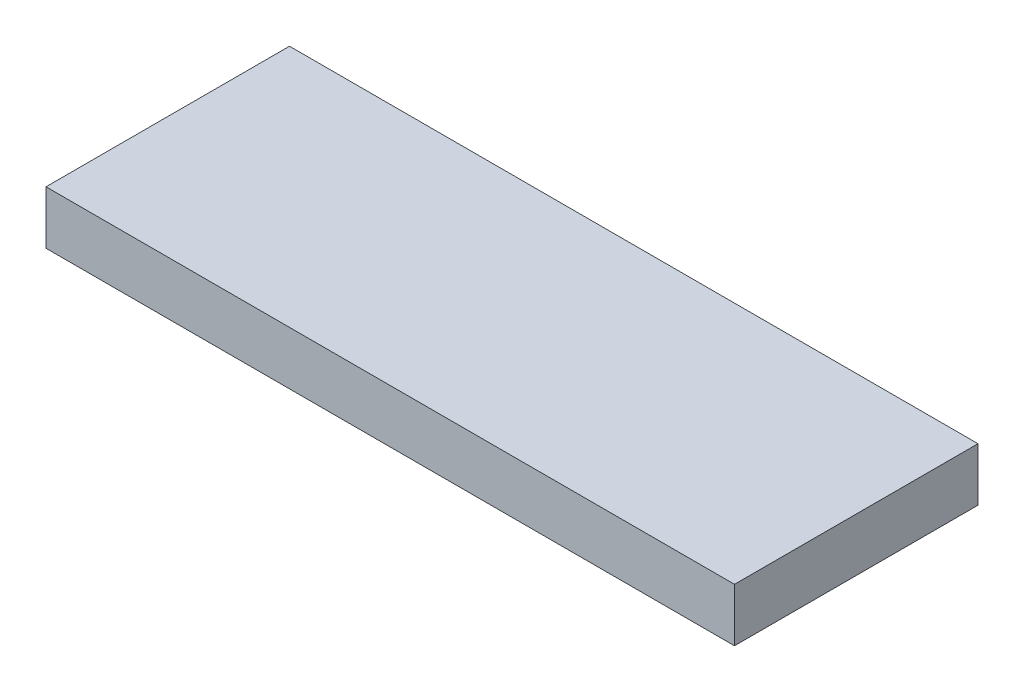
ISO-10303-21;
HEADER;
FILE_DESCRIPTION(('STEP AP214'),'2;1');
FILE_NAME('part.step','',(''),(''),'','','');
FILE_SCHEMA(('AUTOMOTIVE_DESIGN { 1 0 10303 214 1 1 1 1 }'));
ENDSEC;
DATA;
#1=APPLICATION_CONTEXT('core data for automotive mechanical design processes');
#2=APPLICATION_PROTOCOL_DEFINITION('international standard','automotive_design',2000,#1);
#3=PRODUCT_CONTEXT('',#1,'mechanical');
#4=PRODUCT('Part','Part','',(#3));
#5=PRODUCT_RELATED_PRODUCT_CATEGORY('part','',(#4));
#6=PRODUCT_DEFINITION_FORMATION('','',#4);
#7=PRODUCT_DEFINITION_CONTEXT('part definition',#1,'design');
#8=PRODUCT_DEFINITION('design','',#6,#7);
#9=PRODUCT_DEFINITION_SHAPE('','',#8);
#10=(LENGTH_UNIT() NAMED_UNIT(*) SI_UNIT(.MILLI.,.METRE.));
#11=(NAMED_UNIT(*) PLANE_ANGLE_UNIT() SI_UNIT($,.RADIAN.));
#12=(NAMED_UNIT(*) SI_UNIT($,.STERADIAN.) SOLID_ANGLE_UNIT());
#13=UNCERTAINTY_MEASURE_WITH_UNIT(LENGTH_MEASURE(1.E-05),#10,'distance_accuracy_value','');
#14=(GEOMETRIC_REPRESENTATION_CONTEXT(3) GLOBAL_UNCERTAINTY_ASSIGNED_CONTEXT((#13)) GLOBAL_UNIT_ASSIGNED_CONTEXT((#10,
#11,#12)) REPRESENTATION_CONTEXT('',''));
#15=CARTESIAN_POINT('',(0.,0.,0.));
#16=DIRECTION('',(0.,0.,1.));
#17=DIRECTION('',(1.,0.,0.));
#18=AXIS2_PLACEMENT_3D('',#15,#16,#17);
#19=CARTESIAN_POINT('',(0.,44.45,0.));
#20=DIRECTION('',(1.,0.,0.));
#21=DIRECTION('',(0.,0.,-1.));
#22=AXIS2_PLACEMENT_3D('',#19,#20,#21);
#23=PLANE('',#22);
#24=DIRECTION('',(0.,0.,1.));
#25=VECTOR('',#24,1.);
#26=CARTESIAN_POINT('',(0.,0.,0.));
#27=LINE('',#26,#25);
#28=CARTESIAN_POINT('',(0.,0.,-203.2));
#29=VERTEX_POINT('',#28);
#30=CARTESIAN_POINT('',(0.,0.,0.));
#31=VERTEX_POINT('',#30);
#32=EDGE_CURVE('E120',#29,#31,#27,.T.);
#33=ORIENTED_EDGE('',*,*,#32,.T.);
#34=DIRECTION('',(0.,-1.,0.));
#35=VECTOR('',#34,1.);
#36=CARTESIAN_POINT('',(0.,44.45,0.));
#37=LINE('',#36,#35);
#38=CARTESIAN_POINT('',(0.,44.45,0.));
#39=VERTEX_POINT('',#38);
#40=EDGE_CURVE('E11',#39,#31,#37,.T.);
#41=ORIENTED_EDGE('',*,*,#40,.F.);
#42=DIRECTION('',(0.,0.,1.));
#43=VECTOR('',#42,1.);
#44=CARTESIAN_POINT('',(0.,44.45,0.));
#45=LINE('',#44,#43);
#46=CARTESIAN_POINT('',(0.,44.45,-203.2));
#47=VERTEX_POINT('',#46);
#48=EDGE_CURVE('E101',#47,#39,#45,.T.);
#49=ORIENTED_EDGE('',*,*,#48,.F.);
#50=DIRECTION('',(0.,-1.,0.));
#51=VECTOR('',#50,1.);
#52=CARTESIAN_POINT('',(0.,44.45,-203.2));
#53=LINE('',#52,#51);
#54=EDGE_CURVE('E116',#47,#29,#53,.T.);
#55=ORIENTED_EDGE('',*,*,#54,.T.);
#56=EDGE_LOOP('',(#33,#41,#49,#55));
#57=FACE_BOUND('',#56,.T.);
#58=ADVANCED_FACE('F49',(#57),#23,.F.);
#59=CARTESIAN_POINT('',(0.,44.45,0.));
#60=DIRECTION('',(0.,0.,-1.));
#61=DIRECTION('',(-1.,0.,0.));
#62=AXIS2_PLACEMENT_3D('',#59,#60,#61);
#63=PLANE('',#62);
#64=DIRECTION('',(1.,0.,0.));
#65=VECTOR('',#64,1.);
#66=CARTESIAN_POINT('',(0.,0.,0.));
#67=LINE('',#66,#65);
#68=CARTESIAN_POINT('',(574.548,0.,0.));
#69=VERTEX_POINT('',#68);
#70=EDGE_CURVE('E106',#31,#69,#67,.T.);
#71=ORIENTED_EDGE('',*,*,#70,.T.);
#72=DIRECTION('',(0.,-1.,0.));
#73=VECTOR('',#72,1.);
#74=CARTESIAN_POINT('',(574.548,44.45,0.));
#75=LINE('',#74,#73);
#76=CARTESIAN_POINT('',(574.548,44.45,0.));
#77=VERTEX_POINT('',#76);
#78=EDGE_CURVE('E58',#77,#69,#75,.T.);
#79=ORIENTED_EDGE('',*,*,#78,.F.);
#80=DIRECTION('',(1.,0.,0.));
#81=VECTOR('',#80,1.);
#82=CARTESIAN_POINT('',(0.,44.45,0.));
#83=LINE('',#82,#81);
#84=EDGE_CURVE('E96',#39,#77,#83,.T.);
#85=ORIENTED_EDGE('',*,*,#84,.F.);
#86=ORIENTED_EDGE('',*,*,#40,.T.);
#87=EDGE_LOOP('',(#71,#79,#85,#86));
#88=FACE_BOUND('',#87,.T.);
#89=ADVANCED_FACE('F105',(#88),#63,.F.);
#90=CARTESIAN_POINT('',(574.548,44.45,0.));
#91=DIRECTION('',(-1.,0.,0.));
#92=DIRECTION('',(0.,0.,1.));
#93=AXIS2_PLACEMENT_3D('',#90,#91,#92);
#94=PLANE('',#93);
#95=DIRECTION('',(0.,0.,-1.));
#96=VECTOR('',#95,1.);
#97=CARTESIAN_POINT('',(574.548,0.,0.));
#98=LINE('',#97,#96);
#99=CARTESIAN_POINT('',(574.548,0.,-203.2));
#100=VERTEX_POINT('',#99);
#101=EDGE_CURVE('E83',#69,#100,#98,.T.);
#102=ORIENTED_EDGE('',*,*,#101,.T.);
#103=DIRECTION('',(0.,-1.,0.));
#104=VECTOR('',#103,1.);
#105=CARTESIAN_POINT('',(574.548,44.45,-203.2));
#106=LINE('',#105,#104);
#107=CARTESIAN_POINT('',(574.548,44.45,-203.2));
#108=VERTEX_POINT('',#107);
#109=EDGE_CURVE('E108',#108,#100,#106,.T.);
#110=ORIENTED_EDGE('',*,*,#109,.F.);
#111=DIRECTION('',(0.,0.,-1.));
#112=VECTOR('',#111,1.);
#113=CARTESIAN_POINT('',(574.548,44.45,0.));
#114=LINE('',#113,#112);
#115=EDGE_CURVE('E99',#77,#108,#114,.T.);
#116=ORIENTED_EDGE('',*,*,#115,.F.);
#117=ORIENTED_EDGE('',*,*,#78,.T.);
#118=EDGE_LOOP('',(#102,#110,#116,#117));
#119=FACE_BOUND('',#118,.T.);
#120=ADVANCED_FACE('F109',(#119),#94,.F.);
#121=CARTESIAN_POINT('',(0.,44.45,-203.2));
#122=DIRECTION('',(0.,0.,1.));
#123=DIRECTION('',(1.,0.,0.));
#124=AXIS2_PLACEMENT_3D('',#121,#122,#123);
#125=PLANE('',#124);
#126=DIRECTION('',(-1.,0.,0.));
#127=VECTOR('',#126,1.);
#128=CARTESIAN_POINT('',(0.,0.,-203.2));
#129=LINE('',#128,#127);
#130=EDGE_CURVE('E89',#100,#29,#129,.T.);
#131=ORIENTED_EDGE('',*,*,#130,.T.);
#132=ORIENTED_EDGE('',*,*,#54,.F.);
#133=DIRECTION('',(-1.,0.,0.));
#134=VECTOR('',#133,1.);
#135=CARTESIAN_POINT('',(0.,44.45,-203.2));
#136=LINE('',#135,#134);
#137=EDGE_CURVE('E66',#108,#47,#136,.T.);
#138=ORIENTED_EDGE('',*,*,#137,.F.);
#139=ORIENTED_EDGE('',*,*,#109,.T.);
#140=EDGE_LOOP('',(#131,#132,#138,#139));
#141=FACE_BOUND('',#140,.T.);
#142=ADVANCED_FACE('F133',(#141),#125,.F.);
#143=CARTESIAN_POINT('',(0.,44.45,0.));
#144=DIRECTION('',(0.,-1.,0.));
#145=DIRECTION('',(0.,0.,-1.));
#146=AXIS2_PLACEMENT_3D('',#143,#144,#145);
#147=PLANE('',#146);
#148=ORIENTED_EDGE('',*,*,#48,.T.);
#149=ORIENTED_EDGE('',*,*,#84,.T.);
#150=ORIENTED_EDGE('',*,*,#115,.T.);
#151=ORIENTED_EDGE('',*,*,#137,.T.);
#152=EDGE_LOOP('',(#148,#149,#150,#151));
#153=FACE_BOUND('',#152,.T.);
#154=ADVANCED_FACE('F97',(#153),#147,.F.);
#155=CARTESIAN_POINT('',(0.,0.,0.));
#156=DIRECTION('',(0.,-1.,0.));
#157=DIRECTION('',(0.,0.,-1.));
#158=AXIS2_PLACEMENT_3D('',#155,#156,#157);
#159=PLANE('',#158);
#160=ORIENTED_EDGE('',*,*,#32,.F.);
#161=ORIENTED_EDGE('',*,*,#130,.F.);
#162=ORIENTED_EDGE('',*,*,#101,.F.);
#163=ORIENTED_EDGE('',*,*,#70,.F.);
#164=EDGE_LOOP('',(#160,#161,#162,#163));
#165=FACE_BOUND('',#164,.T.);
#166=ADVANCED_FACE('F136',(#165),#159,.T.);
#167=CLOSED_SHELL('',(#58,#89,#120,#142,#154,#166));
#168=MANIFOLD_SOLID_BREP('B2',#167);
#169=ADVANCED_BREP_SHAPE_REPRESENTATION('',(#18,#168),#14);
#170=SHAPE_DEFINITION_REPRESENTATION(#9,#169);
ENDSEC;
END-ISO-10303-21;
